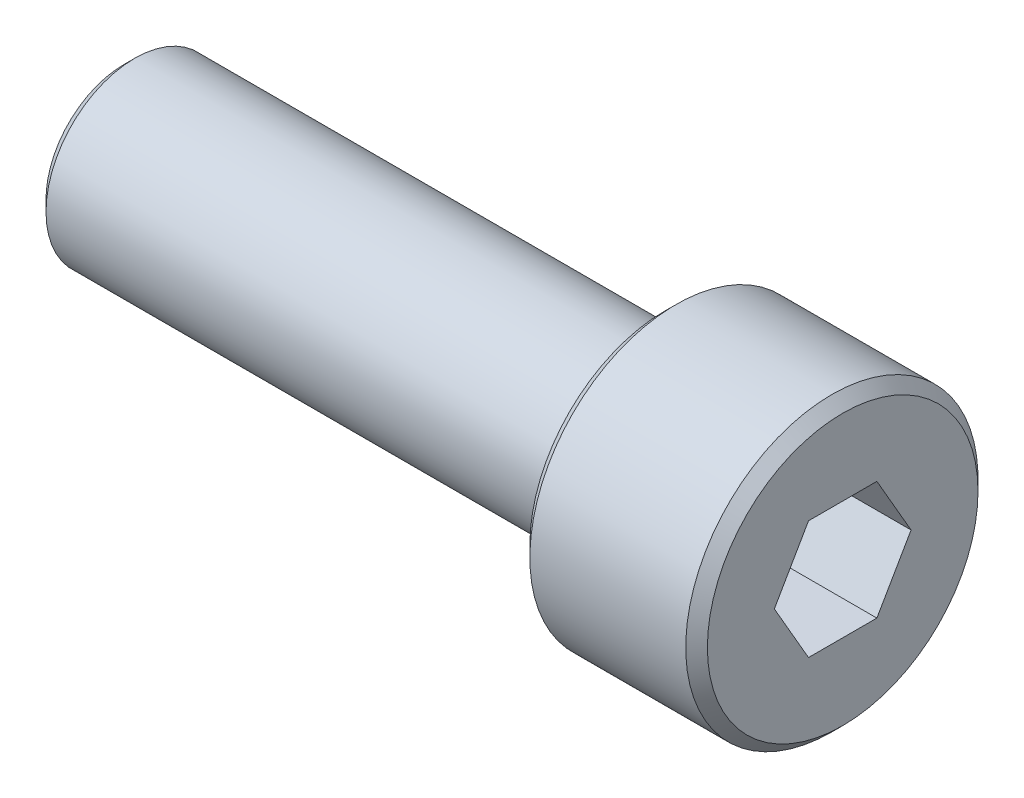
ISO-10303-21;
HEADER;
FILE_DESCRIPTION(('STEP AP214'),'2;1');
FILE_NAME('part.step','',(''),(''),'','','');
FILE_SCHEMA(('AUTOMOTIVE_DESIGN { 1 0 10303 214 1 1 1 1 }'));
ENDSEC;
DATA;
#1=APPLICATION_CONTEXT('core data for automotive mechanical design processes');
#2=APPLICATION_PROTOCOL_DEFINITION('international standard','automotive_design',2000,#1);
#3=PRODUCT_CONTEXT('',#1,'mechanical');
#4=PRODUCT('Part','Part','',(#3));
#5=PRODUCT_RELATED_PRODUCT_CATEGORY('part','',(#4));
#6=PRODUCT_DEFINITION_FORMATION('','',#4);
#7=PRODUCT_DEFINITION_CONTEXT('part definition',#1,'design');
#8=PRODUCT_DEFINITION('design','',#6,#7);
#9=PRODUCT_DEFINITION_SHAPE('','',#8);
#10=(LENGTH_UNIT() NAMED_UNIT(*) SI_UNIT(.MILLI.,.METRE.));
#11=(NAMED_UNIT(*) PLANE_ANGLE_UNIT() SI_UNIT($,.RADIAN.));
#12=(NAMED_UNIT(*) SI_UNIT($,.STERADIAN.) SOLID_ANGLE_UNIT());
#13=UNCERTAINTY_MEASURE_WITH_UNIT(LENGTH_MEASURE(1.E-05),#10,'distance_accuracy_value','');
#14=(GEOMETRIC_REPRESENTATION_CONTEXT(3) GLOBAL_UNCERTAINTY_ASSIGNED_CONTEXT((#13)) GLOBAL_UNIT_ASSIGNED_CONTEXT((#10,
#11,#12)) REPRESENTATION_CONTEXT('',''));
#15=CARTESIAN_POINT('',(0.,0.,0.));
#16=DIRECTION('',(0.,0.,1.));
#17=DIRECTION('',(1.,0.,0.));
#18=AXIS2_PLACEMENT_3D('',#15,#16,#17);
#19=CARTESIAN_POINT('',(14.3255999999997,-1.38906249999997,0.801975608297357));
#20=DIRECTION('',(0.,-1.,0.));
#21=DIRECTION('',(0.,0.,-1.));
#22=AXIS2_PLACEMENT_3D('',#19,#20,#21);
#23=PLANE('',#22);
#24=DIRECTION('',(1.,0.,0.));
#25=VECTOR('',#24,1.);
#26=CARTESIAN_POINT('',(14.3255999999992,-1.38906249999991,-0.801975608295213));
#27=LINE('',#26,#25);
#28=CARTESIAN_POINT('',(16.8655999999994,-1.38906249999994,-0.801975608295124));
#29=VERTEX_POINT('',#28);
#30=CARTESIAN_POINT('',(14.3255999999995,-1.38906249999996,-0.801975608295187));
#31=VERTEX_POINT('',#30);
#32=EDGE_CURVE('E82',#29,#31,#27,.F.);
#33=ORIENTED_EDGE('',*,*,#32,.T.);
#34=DIRECTION('',(0.,0.,-1.));
#35=VECTOR('',#34,1.);
#36=CARTESIAN_POINT('',(14.3255999999997,-1.38906249999997,0.801975608297357));
#37=LINE('',#36,#35);
#38=CARTESIAN_POINT('',(14.3255999999997,-1.38906249999995,0.80197560829728));
#39=VERTEX_POINT('',#38);
#40=EDGE_CURVE('E71',#39,#31,#37,.T.);
#41=ORIENTED_EDGE('',*,*,#40,.F.);
#42=DIRECTION('',(1.,0.,0.));
#43=VECTOR('',#42,1.);
#44=CARTESIAN_POINT('',(14.3256000000002,-1.38906249999988,0.801975608297193));
#45=LINE('',#44,#43);
#46=CARTESIAN_POINT('',(16.8655999999995,-1.38906249999993,0.801975608297261));
#47=VERTEX_POINT('',#46);
#48=EDGE_CURVE('E90',#39,#47,#45,.T.);
#49=ORIENTED_EDGE('',*,*,#48,.T.);
#50=DIRECTION('',(0.,0.,-1.));
#51=VECTOR('',#50,1.);
#52=CARTESIAN_POINT('',(16.8655999999992,-1.38906249999997,0.801975608297357));
#53=LINE('',#52,#51);
#54=EDGE_CURVE('E66',#29,#47,#53,.F.);
#55=ORIENTED_EDGE('',*,*,#54,.F.);
#56=EDGE_LOOP('',(#33,#41,#49,#55));
#57=FACE_BOUND('',#56,.T.);
#58=ADVANCED_FACE('F16',(#57),#23,.F.);
#59=CARTESIAN_POINT('',(14.3255999999992,-1.38906249999997,-0.801975608295178));
#60=DIRECTION('',(0.,-0.499999999999999,-0.866025403784439));
#61=DIRECTION('',(0.,0.866025403784439,-0.499999999999999));
#62=AXIS2_PLACEMENT_3D('',#59,#60,#61);
#63=PLANE('',#62);
#64=DIRECTION('',(1.,0.,0.));
#65=VECTOR('',#64,1.);
#66=CARTESIAN_POINT('',(14.3255999999992,0.,-1.60395121659161));
#67=LINE('',#66,#65);
#68=CARTESIAN_POINT('',(16.8655999999994,0.,-1.60395121659156));
#69=VERTEX_POINT('',#68);
#70=CARTESIAN_POINT('',(14.3255999999992,0.,-1.60395121659152));
#71=VERTEX_POINT('',#70);
#72=EDGE_CURVE('E86',#69,#71,#67,.F.);
#73=ORIENTED_EDGE('',*,*,#72,.T.);
#74=DIRECTION('',(0.,0.866025403784439,-0.499999999999999));
#75=VECTOR('',#74,1.);
#76=CARTESIAN_POINT('',(14.3255999999992,-1.38906249999997,-0.801975608295178));
#77=LINE('',#76,#75);
#78=EDGE_CURVE('E75',#31,#71,#77,.T.);
#79=ORIENTED_EDGE('',*,*,#78,.F.);
#80=ORIENTED_EDGE('',*,*,#32,.F.);
#81=DIRECTION('',(0.,0.866025403784439,-0.499999999999999));
#82=VECTOR('',#81,1.);
#83=CARTESIAN_POINT('',(16.8655999999992,-1.38906249999997,-0.801975608295176));
#84=LINE('',#83,#82);
#85=EDGE_CURVE('E88',#69,#29,#84,.F.);
#86=ORIENTED_EDGE('',*,*,#85,.F.);
#87=EDGE_LOOP('',(#73,#79,#80,#86));
#88=FACE_BOUND('',#87,.T.);
#89=ADVANCED_FACE('F85',(#88),#63,.F.);
#90=CARTESIAN_POINT('',(14.3256000000002,0.,1.60395121659333));
#91=DIRECTION('',(0.,-0.500000000000001,0.866025403784438));
#92=DIRECTION('',(0.,-0.866025403784438,-0.500000000000001));
#93=AXIS2_PLACEMENT_3D('',#90,#91,#92);
#94=PLANE('',#93);
#95=ORIENTED_EDGE('',*,*,#48,.F.);
#96=DIRECTION('',(0.,0.866025403784497,0.499999999999899));
#97=VECTOR('',#96,1.);
#98=CARTESIAN_POINT('',(14.3255999999992,-1.38906249999997,0.801975608297357));
#99=LINE('',#98,#97);
#100=CARTESIAN_POINT('',(14.3255999999996,0.,1.60395121659331));
#101=VERTEX_POINT('',#100);
#102=EDGE_CURVE('E78',#39,#101,#99,.T.);
#103=ORIENTED_EDGE('',*,*,#102,.T.);
#104=DIRECTION('',(1.,0.,0.));
#105=VECTOR('',#104,1.);
#106=CARTESIAN_POINT('',(14.3255999999999,0.,1.60395121659323));
#107=LINE('',#106,#105);
#108=CARTESIAN_POINT('',(16.8655999999999,0.,1.6039512165933));
#109=VERTEX_POINT('',#108);
#110=EDGE_CURVE('E124',#101,#109,#107,.T.);
#111=ORIENTED_EDGE('',*,*,#110,.T.);
#112=DIRECTION('',(0.,-0.866025403784438,-0.500000000000001));
#113=VECTOR('',#112,1.);
#114=CARTESIAN_POINT('',(16.8655999999997,0.,1.60395121659333));
#115=LINE('',#114,#113);
#116=EDGE_CURVE('E134',#47,#109,#115,.F.);
#117=ORIENTED_EDGE('',*,*,#116,.F.);
#118=EDGE_LOOP('',(#95,#103,#111,#117));
#119=FACE_BOUND('',#118,.T.);
#120=ADVANCED_FACE('F137',(#119),#94,.F.);
#121=CARTESIAN_POINT('',(14.3255999999992,0.,-1.60395121659158));
#122=DIRECTION('',(0.,0.500000000000001,-0.866025403784438));
#123=DIRECTION('',(0.,0.866025403784438,0.500000000000001));
#124=AXIS2_PLACEMENT_3D('',#121,#122,#123);
#125=PLANE('',#124);
#126=DIRECTION('',(1.,0.,0.));
#127=VECTOR('',#126,1.);
#128=CARTESIAN_POINT('',(14.3255999999992,1.38906250000006,-0.801975608295293));
#129=LINE('',#128,#127);
#130=CARTESIAN_POINT('',(16.8655999999996,1.38906250000008,-0.801975608295318));
#131=VERTEX_POINT('',#130);
#132=CARTESIAN_POINT('',(14.3255999999992,1.38906250000008,-0.801975608295315));
#133=VERTEX_POINT('',#132);
#134=EDGE_CURVE('E120',#131,#133,#129,.F.);
#135=ORIENTED_EDGE('',*,*,#134,.T.);
#136=DIRECTION('',(0.,-0.866025403784423,-0.500000000000027));
#137=VECTOR('',#136,1.);
#138=CARTESIAN_POINT('',(14.3255999999992,1.38906250000006,-0.801975608295303));
#139=LINE('',#138,#137);
#140=EDGE_CURVE('E129',#133,#71,#139,.T.);
#141=ORIENTED_EDGE('',*,*,#140,.T.);
#142=ORIENTED_EDGE('',*,*,#72,.F.);
#143=DIRECTION('',(0.,0.866025403784438,0.500000000000001));
#144=VECTOR('',#143,1.);
#145=CARTESIAN_POINT('',(16.8655999999994,0.,-1.60395121659158));
#146=LINE('',#145,#144);
#147=EDGE_CURVE('E34',#131,#69,#146,.F.);
#148=ORIENTED_EDGE('',*,*,#147,.F.);
#149=EDGE_LOOP('',(#135,#141,#142,#148));
#150=FACE_BOUND('',#149,.T.);
#151=ADVANCED_FACE('F144',(#150),#125,.F.);
#152=CARTESIAN_POINT('',(14.3255999999992,-1.38906249999989,-2.40592682488804));
#153=DIRECTION('',(-1.,0.,0.));
#154=DIRECTION('',(0.,-1.,0.));
#155=AXIS2_PLACEMENT_3D('',#152,#153,#154);
#156=PLANE('',#155);
#157=DIRECTION('',(0.,0.,1.));
#158=VECTOR('',#157,1.);
#159=CARTESIAN_POINT('',(14.3255999999992,1.38906250000006,-0.801975608295303));
#160=LINE('',#159,#158);
#161=CARTESIAN_POINT('',(14.3255999999994,1.38906250000008,0.801975608296928));
#162=VERTEX_POINT('',#161);
#163=EDGE_CURVE('E118',#133,#162,#160,.T.);
#164=ORIENTED_EDGE('',*,*,#163,.T.);
#165=DIRECTION('',(0.,-0.866025403784439,0.499999999999999));
#166=VECTOR('',#165,1.);
#167=CARTESIAN_POINT('',(14.3255999999999,1.3890625000001,0.80197560829692));
#168=LINE('',#167,#166);
#169=EDGE_CURVE('E127',#162,#101,#168,.T.);
#170=ORIENTED_EDGE('',*,*,#169,.T.);
#171=ORIENTED_EDGE('',*,*,#102,.F.);
#172=ORIENTED_EDGE('',*,*,#40,.T.);
#173=ORIENTED_EDGE('',*,*,#78,.T.);
#174=ORIENTED_EDGE('',*,*,#140,.F.);
#175=EDGE_LOOP('',(#164,#170,#171,#172,#173,#174));
#176=FACE_BOUND('',#175,.T.);
#177=ADVANCED_FACE('F72',(#176),#156,.F.);
#178=CARTESIAN_POINT('',(14.3255999999999,1.3890625000001,0.80197560829692));
#179=DIRECTION('',(0.,0.499999999999999,0.866025403784439));
#180=DIRECTION('',(0.,-0.866025403784439,0.499999999999999));
#181=AXIS2_PLACEMENT_3D('',#178,#179,#180);
#182=PLANE('',#181);
#183=ORIENTED_EDGE('',*,*,#110,.F.);
#184=ORIENTED_EDGE('',*,*,#169,.F.);
#185=DIRECTION('',(1.,0.,0.));
#186=VECTOR('',#185,1.);
#187=CARTESIAN_POINT('',(14.3255999999992,1.38906250000006,0.80197560829692));
#188=LINE('',#187,#186);
#189=CARTESIAN_POINT('',(16.8656000000001,1.38906250000006,0.801975608296986));
#190=VERTEX_POINT('',#189);
#191=EDGE_CURVE('E115',#162,#190,#188,.T.);
#192=ORIENTED_EDGE('',*,*,#191,.T.);
#193=DIRECTION('',(0.,-0.866025403784439,0.499999999999999));
#194=VECTOR('',#193,1.);
#195=CARTESIAN_POINT('',(16.8656000000002,1.3890625000001,0.801975608296921));
#196=LINE('',#195,#194);
#197=EDGE_CURVE('E122',#109,#190,#196,.F.);
#198=ORIENTED_EDGE('',*,*,#197,.F.);
#199=EDGE_LOOP('',(#183,#184,#192,#198));
#200=FACE_BOUND('',#199,.T.);
#201=ADVANCED_FACE('F151',(#200),#182,.F.);
#202=CARTESIAN_POINT('',(14.3255999999992,1.38906250000006,-0.801975608295303));
#203=DIRECTION('',(0.,1.,0.));
#204=DIRECTION('',(0.,0.,1.));
#205=AXIS2_PLACEMENT_3D('',#202,#203,#204);
#206=PLANE('',#205);
#207=ORIENTED_EDGE('',*,*,#191,.F.);
#208=ORIENTED_EDGE('',*,*,#163,.F.);
#209=ORIENTED_EDGE('',*,*,#134,.F.);
#210=DIRECTION('',(0.,0.,1.));
#211=VECTOR('',#210,1.);
#212=CARTESIAN_POINT('',(16.8655999999999,1.38906250000008,9.92261828258734E-13));
#213=LINE('',#212,#211);
#214=EDGE_CURVE('E112',#131,#190,#213,.T.);
#215=ORIENTED_EDGE('',*,*,#214,.T.);
#216=EDGE_LOOP('',(#207,#208,#209,#215));
#217=FACE_BOUND('',#216,.T.);
#218=ADVANCED_FACE('F149',(#217),#206,.F.);
#219=CARTESIAN_POINT('',(16.8655999999999,3.42900000000015,9.92261828258734E-13));
#220=DIRECTION('',(-1.,0.,0.));
#221=DIRECTION('',(0.,-1.,0.));
#222=AXIS2_PLACEMENT_3D('',#219,#220,#221);
#223=PLANE('',#222);
#224=ORIENTED_EDGE('',*,*,#147,.T.);
#225=ORIENTED_EDGE('',*,*,#85,.T.);
#226=ORIENTED_EDGE('',*,*,#54,.T.);
#227=ORIENTED_EDGE('',*,*,#116,.T.);
#228=ORIENTED_EDGE('',*,*,#197,.T.);
#229=ORIENTED_EDGE('',*,*,#214,.F.);
#230=EDGE_LOOP('',(#224,#225,#226,#227,#228,#229));
#231=FACE_BOUND('',#230,.T.);
#232=CARTESIAN_POINT('',(16.8655999999601,0.,9.47030519848086E-13));
#233=DIRECTION('',(-1.,0.,0.));
#234=DIRECTION('',(0.,-1.,0.));
#235=AXIS2_PLACEMENT_3D('',#232,#233,#234);
#236=CIRCLE('',#235,3.17499999999787);
#237=CARTESIAN_POINT('',(16.8655999999601,-3.17499999999777,9.47030519848086E-13));
#238=VERTEX_POINT('',#237);
#239=EDGE_CURVE('E19',#238,#238,#236,.T.);
#240=ORIENTED_EDGE('',*,*,#239,.F.);
#241=EDGE_LOOP('',(#240));
#242=FACE_BOUND('',#241,.T.);
#243=ADVANCED_FACE('F141',(#231,#242),#223,.F.);
#244=CARTESIAN_POINT('',(16.6115999999761,0.,9.47159017883337E-13));
#245=DIRECTION('',(-1.,0.,0.));
#246=DIRECTION('',(0.,-1.,0.));
#247=AXIS2_PLACEMENT_3D('',#244,#245,#246);
#248=CONICAL_SURFACE('',#247,3.42899999998186,0.785398163397448);
#249=ORIENTED_EDGE('',*,*,#239,.T.);
#250=EDGE_LOOP('',(#249));
#251=FACE_BOUND('',#250,.T.);
#252=CARTESIAN_POINT('',(16.6115999999996,0.,0.));
#253=DIRECTION('',(-1.,0.,0.));
#254=DIRECTION('',(0.,-1.,0.));
#255=AXIS2_PLACEMENT_3D('',#252,#253,#254);
#256=CIRCLE('',#255,3.42900000000003);
#257=CARTESIAN_POINT('',(16.6115999999996,-3.42900000000004,0.));
#258=VERTEX_POINT('',#257);
#259=EDGE_CURVE('E105',#258,#258,#256,.T.);
#260=ORIENTED_EDGE('',*,*,#259,.F.);
#261=EDGE_LOOP('',(#260));
#262=FACE_BOUND('',#261,.T.);
#263=ADVANCED_FACE('F187',(#251,#262),#248,.T.);
#264=CARTESIAN_POINT('',(-4.02455846426619E-13,0.,0.));
#265=DIRECTION('',(-1.,0.,0.));
#266=DIRECTION('',(0.,-1.,0.));
#267=AXIS2_PLACEMENT_3D('',#264,#265,#266);
#268=CYLINDRICAL_SURFACE('',#267,3.42900000000003);
#269=ORIENTED_EDGE('',*,*,#259,.T.);
#270=EDGE_LOOP('',(#269));
#271=FACE_BOUND('',#270,.T.);
#272=CARTESIAN_POINT('',(12.9539999999793,-1.26823761481491E-13,1.07195565235836E-12));
#273=DIRECTION('',(1.,0.,0.));
#274=DIRECTION('',(0.,0.,-1.));
#275=AXIS2_PLACEMENT_3D('',#272,#273,#274);
#276=CIRCLE('',#275,3.42899999998388);
#277=CARTESIAN_POINT('',(12.9539999999793,-1.32248672002327E-13,-3.42899999998281));
#278=VERTEX_POINT('',#277);
#279=EDGE_CURVE('E101',#278,#278,#276,.F.);
#280=ORIENTED_EDGE('',*,*,#279,.F.);
#281=EDGE_LOOP('',(#280));
#282=FACE_BOUND('',#281,.T.);
#283=ADVANCED_FACE('F184',(#271,#282),#268,.T.);
#284=CARTESIAN_POINT('',(12.9539999999793,-1.26823761481491E-13,1.07205910815367E-12));
#285=DIRECTION('',(1.,0.,0.));
#286=DIRECTION('',(0.,0.,-1.));
#287=AXIS2_PLACEMENT_3D('',#284,#285,#286);
#288=CONICAL_SURFACE('',#287,3.42899999998388,0.785398163397445);
#289=CARTESIAN_POINT('',(12.6999999999953,-1.26695263446241E-13,1.07225185520654E-12));
#290=DIRECTION('',(1.,0.,0.));
#291=DIRECTION('',(0.,0.,-1.));
#292=AXIS2_PLACEMENT_3D('',#289,#290,#291);
#293=CIRCLE('',#292,3.17499999999989);
#294=CARTESIAN_POINT('',(12.6999999999953,-1.26695263446241E-13,-3.17499999999881));
#295=VERTEX_POINT('',#294);
#296=EDGE_CURVE('E99',#295,#295,#293,.T.);
#297=ORIENTED_EDGE('',*,*,#296,.T.);
#298=EDGE_LOOP('',(#297));
#299=FACE_BOUND('',#298,.T.);
#300=ORIENTED_EDGE('',*,*,#279,.T.);
#301=EDGE_LOOP('',(#300));
#302=FACE_BOUND('',#301,.T.);
#303=ADVANCED_FACE('F180',(#299,#302),#288,.T.);
#304=CARTESIAN_POINT('',(-4.02455846426619E-13,0.,0.));
#305=DIRECTION('',(1.,0.,0.));
#306=DIRECTION('',(0.,1.,0.));
#307=AXIS2_PLACEMENT_3D('',#304,#305,#306);
#308=PLANE('',#307);
#309=CARTESIAN_POINT('',(0.,0.,0.));
#310=DIRECTION('',(1.,0.,0.));
#311=DIRECTION('',(0.,1.,0.));
#312=AXIS2_PLACEMENT_3D('',#309,#310,#311);
#313=CIRCLE('',#312,1.82879999999843);
#314=CARTESIAN_POINT('',(0.,1.82879999999843,0.));
#315=VERTEX_POINT('',#314);
#316=EDGE_CURVE('E97',#315,#315,#313,.T.);
#317=ORIENTED_EDGE('',*,*,#316,.F.);
#318=EDGE_LOOP('',(#317));
#319=FACE_BOUND('',#318,.T.);
#320=ADVANCED_FACE('F176',(#319),#308,.F.);
#321=CARTESIAN_POINT('',(12.6999999999998,2.08279999999995,3.81639164714898E-13));
#322=DIRECTION('',(1.,0.,0.));
#323=DIRECTION('',(0.,1.,0.));
#324=AXIS2_PLACEMENT_3D('',#321,#322,#323);
#325=PLANE('',#324);
#326=CARTESIAN_POINT('',(12.6999999999996,0.,0.));
#327=DIRECTION('',(-1.,0.,0.));
#328=DIRECTION('',(0.,-1.,0.));
#329=AXIS2_PLACEMENT_3D('',#326,#327,#328);
#330=CIRCLE('',#329,2.08280000000001);
#331=CARTESIAN_POINT('',(12.6999999999996,-2.08280000000003,0.));
#332=VERTEX_POINT('',#331);
#333=EDGE_CURVE('E25',#332,#332,#330,.T.);
#334=ORIENTED_EDGE('',*,*,#333,.F.);
#335=EDGE_LOOP('',(#334));
#336=FACE_BOUND('',#335,.T.);
#337=ORIENTED_EDGE('',*,*,#296,.F.);
#338=EDGE_LOOP('',(#337));
#339=FACE_BOUND('',#338,.T.);
#340=ADVANCED_FACE('F169',(#336,#339),#325,.F.);
#341=CARTESIAN_POINT('',(0.25399999998399,0.,0.));
#342=DIRECTION('',(1.,0.,0.));
#343=DIRECTION('',(0.,1.,0.));
#344=AXIS2_PLACEMENT_3D('',#341,#342,#343);
#345=CONICAL_SURFACE('',#344,2.08279999998242,0.785398163397448);
#346=CARTESIAN_POINT('',(0.253999999999574,0.,0.));
#347=DIRECTION('',(-1.,0.,0.));
#348=DIRECTION('',(0.,-1.,0.));
#349=AXIS2_PLACEMENT_3D('',#346,#347,#348);
#350=CIRCLE('',#349,2.08280000000001);
#351=CARTESIAN_POINT('',(0.253999999999572,-2.08280000000002,0.));
#352=VERTEX_POINT('',#351);
#353=EDGE_CURVE('E11',#352,#352,#350,.F.);
#354=ORIENTED_EDGE('',*,*,#353,.F.);
#355=EDGE_LOOP('',(#354));
#356=FACE_BOUND('',#355,.T.);
#357=ORIENTED_EDGE('',*,*,#316,.T.);
#358=EDGE_LOOP('',(#357));
#359=FACE_BOUND('',#358,.T.);
#360=ADVANCED_FACE('F163',(#356,#359),#345,.T.);
#361=CARTESIAN_POINT('',(-4.02455846426619E-13,0.,0.));
#362=DIRECTION('',(-1.,0.,0.));
#363=DIRECTION('',(0.,-1.,0.));
#364=AXIS2_PLACEMENT_3D('',#361,#362,#363);
#365=CYLINDRICAL_SURFACE('',#364,2.08280000000001);
#366=ORIENTED_EDGE('',*,*,#353,.T.);
#367=EDGE_LOOP('',(#366));
#368=FACE_BOUND('',#367,.T.);
#369=ORIENTED_EDGE('',*,*,#333,.T.);
#370=EDGE_LOOP('',(#369));
#371=FACE_BOUND('',#370,.T.);
#372=ADVANCED_FACE('F161',(#368,#371),#365,.T.);
#373=CLOSED_SHELL('',(#58,#89,#120,#151,#177,#201,#218,#243,#263,#283,#303,#320,#340,#360,#372));
#374=MANIFOLD_SOLID_BREP('B1',#373);
#375=ADVANCED_BREP_SHAPE_REPRESENTATION('',(#18,#374),#14);
#376=SHAPE_DEFINITION_REPRESENTATION(#9,#375);
ENDSEC;
END-ISO-10303-21;
